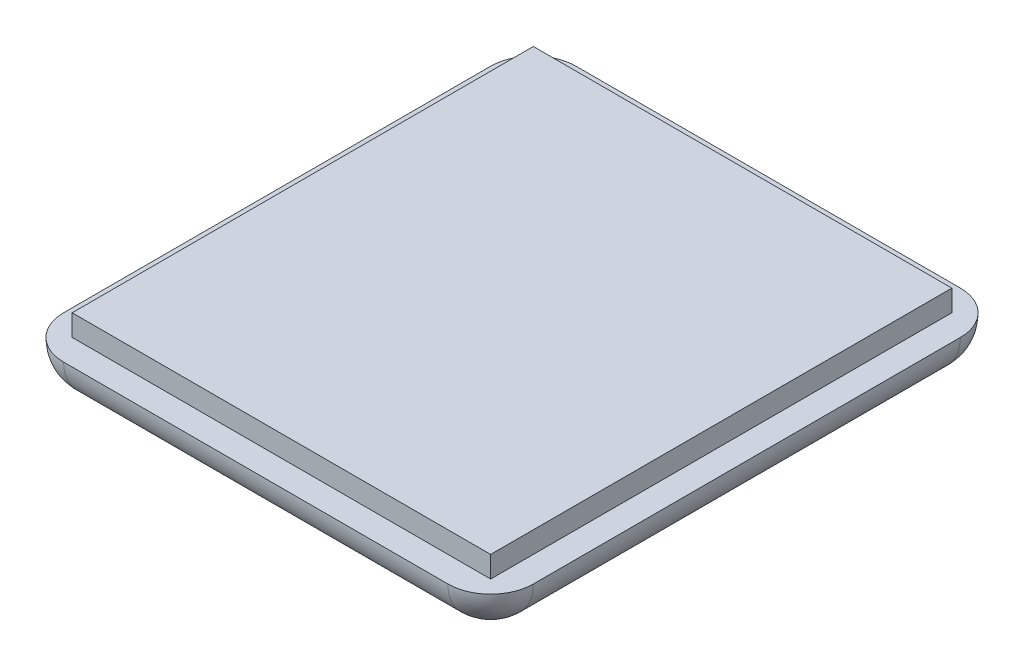
ISO-10303-21;
HEADER;
FILE_DESCRIPTION(('STEP AP214'),'2;1');
FILE_NAME('part.step','',(''),(''),'','','');
FILE_SCHEMA(('AUTOMOTIVE_DESIGN { 1 0 10303 214 1 1 1 1 }'));
ENDSEC;
DATA;
#1=APPLICATION_CONTEXT('core data for automotive mechanical design processes');
#2=APPLICATION_PROTOCOL_DEFINITION('international standard','automotive_design',2000,#1);
#3=PRODUCT_CONTEXT('',#1,'mechanical');
#4=PRODUCT('Part','Part','',(#3));
#5=PRODUCT_RELATED_PRODUCT_CATEGORY('part','',(#4));
#6=PRODUCT_DEFINITION_FORMATION('','',#4);
#7=PRODUCT_DEFINITION_CONTEXT('part definition',#1,'design');
#8=PRODUCT_DEFINITION('design','',#6,#7);
#9=PRODUCT_DEFINITION_SHAPE('','',#8);
#10=(LENGTH_UNIT() NAMED_UNIT(*) SI_UNIT(.MILLI.,.METRE.));
#11=(NAMED_UNIT(*) PLANE_ANGLE_UNIT() SI_UNIT($,.RADIAN.));
#12=(NAMED_UNIT(*) SI_UNIT($,.STERADIAN.) SOLID_ANGLE_UNIT());
#13=UNCERTAINTY_MEASURE_WITH_UNIT(LENGTH_MEASURE(1.E-05),#10,'distance_accuracy_value','');
#14=(GEOMETRIC_REPRESENTATION_CONTEXT(3) GLOBAL_UNCERTAINTY_ASSIGNED_CONTEXT((#13)) GLOBAL_UNIT_ASSIGNED_CONTEXT((#10,
#11,#12)) REPRESENTATION_CONTEXT('',''));
#15=CARTESIAN_POINT('',(0.,0.,0.));
#16=DIRECTION('',(0.,0.,1.));
#17=DIRECTION('',(1.,0.,0.));
#18=AXIS2_PLACEMENT_3D('',#15,#16,#17);
#19=CARTESIAN_POINT('',(-24.5,2.5,-27.));
#20=DIRECTION('',(1.,0.,0.));
#21=DIRECTION('',(0.,0.,-1.));
#22=AXIS2_PLACEMENT_3D('',#19,#20,#21);
#23=PLANE('',#22);
#24=DIRECTION('',(0.,0.,1.));
#25=VECTOR('',#24,1.);
#26=CARTESIAN_POINT('',(-24.5,0.,-27.));
#27=LINE('',#26,#25);
#28=CARTESIAN_POINT('',(-24.5,0.,-27.));
#29=VERTEX_POINT('',#28);
#30=CARTESIAN_POINT('',(-24.5,0.,27.));
#31=VERTEX_POINT('',#30);
#32=EDGE_CURVE('E119',#29,#31,#27,.T.);
#33=ORIENTED_EDGE('',*,*,#32,.T.);
#34=DIRECTION('',(0.,-1.,0.));
#35=VECTOR('',#34,1.);
#36=CARTESIAN_POINT('',(-24.5,2.5,27.));
#37=LINE('',#36,#35);
#38=CARTESIAN_POINT('',(-24.5,2.5,27.));
#39=VERTEX_POINT('',#38);
#40=EDGE_CURVE('E129',#39,#31,#37,.T.);
#41=ORIENTED_EDGE('',*,*,#40,.F.);
#42=DIRECTION('',(0.,0.,1.));
#43=VECTOR('',#42,1.);
#44=CARTESIAN_POINT('',(-24.5,2.5,-27.));
#45=LINE('',#44,#43);
#46=CARTESIAN_POINT('',(-24.5,2.5,-27.));
#47=VERTEX_POINT('',#46);
#48=EDGE_CURVE('E156',#47,#39,#45,.T.);
#49=ORIENTED_EDGE('',*,*,#48,.F.);
#50=DIRECTION('',(0.,-1.,0.));
#51=VECTOR('',#50,1.);
#52=CARTESIAN_POINT('',(-24.5,2.5,-27.));
#53=LINE('',#52,#51);
#54=EDGE_CURVE('E141',#47,#29,#53,.T.);
#55=ORIENTED_EDGE('',*,*,#54,.T.);
#56=EDGE_LOOP('',(#33,#41,#49,#55));
#57=FACE_BOUND('',#56,.T.);
#58=ADVANCED_FACE('F39',(#57),#23,.F.);
#59=CARTESIAN_POINT('',(-24.5,2.5,27.));
#60=DIRECTION('',(0.,0.,-1.));
#61=DIRECTION('',(-1.,0.,0.));
#62=AXIS2_PLACEMENT_3D('',#59,#60,#61);
#63=PLANE('',#62);
#64=DIRECTION('',(1.,0.,0.));
#65=VECTOR('',#64,1.);
#66=CARTESIAN_POINT('',(-24.5,0.,27.));
#67=LINE('',#66,#65);
#68=CARTESIAN_POINT('',(24.5,0.,27.));
#69=VERTEX_POINT('',#68);
#70=EDGE_CURVE('E115',#31,#69,#67,.T.);
#71=ORIENTED_EDGE('',*,*,#70,.T.);
#72=DIRECTION('',(0.,-1.,0.));
#73=VECTOR('',#72,1.);
#74=CARTESIAN_POINT('',(24.5,2.5,27.));
#75=LINE('',#74,#73);
#76=CARTESIAN_POINT('',(24.5,2.5,27.));
#77=VERTEX_POINT('',#76);
#78=EDGE_CURVE('E137',#77,#69,#75,.T.);
#79=ORIENTED_EDGE('',*,*,#78,.F.);
#80=DIRECTION('',(1.,0.,0.));
#81=VECTOR('',#80,1.);
#82=CARTESIAN_POINT('',(-24.5,2.5,27.));
#83=LINE('',#82,#81);
#84=EDGE_CURVE('E131',#39,#77,#83,.T.);
#85=ORIENTED_EDGE('',*,*,#84,.F.);
#86=ORIENTED_EDGE('',*,*,#40,.T.);
#87=EDGE_LOOP('',(#71,#79,#85,#86));
#88=FACE_BOUND('',#87,.T.);
#89=ADVANCED_FACE('F130',(#88),#63,.F.);
#90=CARTESIAN_POINT('',(24.5,2.5,-27.));
#91=DIRECTION('',(-1.,0.,0.));
#92=DIRECTION('',(0.,0.,1.));
#93=AXIS2_PLACEMENT_3D('',#90,#91,#92);
#94=PLANE('',#93);
#95=DIRECTION('',(0.,0.,-1.));
#96=VECTOR('',#95,1.);
#97=CARTESIAN_POINT('',(24.5,0.,-27.));
#98=LINE('',#97,#96);
#99=CARTESIAN_POINT('',(24.5,0.,-27.));
#100=VERTEX_POINT('',#99);
#101=EDGE_CURVE('E122',#69,#100,#98,.T.);
#102=ORIENTED_EDGE('',*,*,#101,.T.);
#103=DIRECTION('',(0.,-1.,0.));
#104=VECTOR('',#103,1.);
#105=CARTESIAN_POINT('',(24.5,2.5,-27.));
#106=LINE('',#105,#104);
#107=CARTESIAN_POINT('',(24.5,2.5,-27.));
#108=VERTEX_POINT('',#107);
#109=EDGE_CURVE('E159',#108,#100,#106,.T.);
#110=ORIENTED_EDGE('',*,*,#109,.F.);
#111=DIRECTION('',(0.,0.,-1.));
#112=VECTOR('',#111,1.);
#113=CARTESIAN_POINT('',(24.5,2.5,-27.));
#114=LINE('',#113,#112);
#115=EDGE_CURVE('E235',#77,#108,#114,.T.);
#116=ORIENTED_EDGE('',*,*,#115,.F.);
#117=ORIENTED_EDGE('',*,*,#78,.T.);
#118=EDGE_LOOP('',(#102,#110,#116,#117));
#119=FACE_BOUND('',#118,.T.);
#120=ADVANCED_FACE('F246',(#119),#94,.F.);
#121=CARTESIAN_POINT('',(-24.5,2.5,-27.));
#122=DIRECTION('',(0.,0.,1.));
#123=DIRECTION('',(1.,0.,0.));
#124=AXIS2_PLACEMENT_3D('',#121,#122,#123);
#125=PLANE('',#124);
#126=DIRECTION('',(-1.,0.,0.));
#127=VECTOR('',#126,1.);
#128=CARTESIAN_POINT('',(-24.5,0.,-27.));
#129=LINE('',#128,#127);
#130=EDGE_CURVE('E153',#100,#29,#129,.T.);
#131=ORIENTED_EDGE('',*,*,#130,.T.);
#132=ORIENTED_EDGE('',*,*,#54,.F.);
#133=DIRECTION('',(-1.,0.,0.));
#134=VECTOR('',#133,1.);
#135=CARTESIAN_POINT('',(-24.5,2.5,-27.));
#136=LINE('',#135,#134);
#137=EDGE_CURVE('E148',#108,#47,#136,.T.);
#138=ORIENTED_EDGE('',*,*,#137,.F.);
#139=ORIENTED_EDGE('',*,*,#109,.T.);
#140=EDGE_LOOP('',(#131,#132,#138,#139));
#141=FACE_BOUND('',#140,.T.);
#142=ADVANCED_FACE('F244',(#141),#125,.F.);
#143=CARTESIAN_POINT('',(0.,2.5,0.));
#144=DIRECTION('',(0.,1.,0.));
#145=DIRECTION('',(0.,0.,1.));
#146=AXIS2_PLACEMENT_3D('',#143,#144,#145);
#147=PLANE('',#146);
#148=ORIENTED_EDGE('',*,*,#48,.T.);
#149=ORIENTED_EDGE('',*,*,#84,.T.);
#150=ORIENTED_EDGE('',*,*,#115,.T.);
#151=ORIENTED_EDGE('',*,*,#137,.T.);
#152=EDGE_LOOP('',(#148,#149,#150,#151));
#153=FACE_BOUND('',#152,.T.);
#154=ADVANCED_FACE('F242',(#153),#147,.T.);
#155=CARTESIAN_POINT('',(0.,-5.,0.));
#156=DIRECTION('',(0.,-1.,0.));
#157=DIRECTION('',(0.,0.,-1.));
#158=AXIS2_PLACEMENT_3D('',#155,#156,#157);
#159=PLANE('',#158);
#160=DIRECTION('',(-1.,0.,0.));
#161=VECTOR('',#160,1.);
#162=CARTESIAN_POINT('',(-27.5,-5.,25.));
#163=LINE('',#162,#161);
#164=CARTESIAN_POINT('',(22.5,-5.,25.));
#165=VERTEX_POINT('',#164);
#166=CARTESIAN_POINT('',(-22.5,-5.,25.));
#167=VERTEX_POINT('',#166);
#168=EDGE_CURVE('E136',#165,#167,#163,.T.);
#169=ORIENTED_EDGE('',*,*,#168,.T.);
#170=DIRECTION('',(0.,0.,-1.));
#171=VECTOR('',#170,1.);
#172=CARTESIAN_POINT('',(-22.5,-5.,-30.));
#173=LINE('',#172,#171);
#174=CARTESIAN_POINT('',(-22.5,-5.,-25.));
#175=VERTEX_POINT('',#174);
#176=EDGE_CURVE('E173',#167,#175,#173,.T.);
#177=ORIENTED_EDGE('',*,*,#176,.T.);
#178=DIRECTION('',(1.,0.,0.));
#179=VECTOR('',#178,1.);
#180=CARTESIAN_POINT('',(27.5,-5.,-25.));
#181=LINE('',#180,#179);
#182=CARTESIAN_POINT('',(22.5,-5.,-25.));
#183=VERTEX_POINT('',#182);
#184=EDGE_CURVE('E170',#175,#183,#181,.T.);
#185=ORIENTED_EDGE('',*,*,#184,.T.);
#186=DIRECTION('',(0.,0.,1.));
#187=VECTOR('',#186,1.);
#188=CARTESIAN_POINT('',(22.5,-5.,30.));
#189=LINE('',#188,#187);
#190=EDGE_CURVE('E167',#183,#165,#189,.T.);
#191=ORIENTED_EDGE('',*,*,#190,.T.);
#192=EDGE_LOOP('',(#169,#177,#185,#191));
#193=FACE_BOUND('',#192,.T.);
#194=ADVANCED_FACE('F290',(#193),#159,.T.);
#195=CARTESIAN_POINT('',(0.,0.,0.));
#196=DIRECTION('',(0.,-1.,0.));
#197=DIRECTION('',(0.,0.,-1.));
#198=AXIS2_PLACEMENT_3D('',#195,#196,#197);
#199=PLANE('',#198);
#200=ORIENTED_EDGE('',*,*,#32,.F.);
#201=ORIENTED_EDGE('',*,*,#130,.F.);
#202=ORIENTED_EDGE('',*,*,#101,.F.);
#203=ORIENTED_EDGE('',*,*,#70,.F.);
#204=EDGE_LOOP('',(#200,#201,#202,#203));
#205=FACE_BOUND('',#204,.T.);
#206=DIRECTION('',(0.,0.,-1.));
#207=VECTOR('',#206,1.);
#208=CARTESIAN_POINT('',(-27.5,0.,30.));
#209=LINE('',#208,#207);
#210=CARTESIAN_POINT('',(-27.5,0.,25.));
#211=VERTEX_POINT('',#210);
#212=CARTESIAN_POINT('',(-27.5,0.,-25.));
#213=VERTEX_POINT('',#212);
#214=EDGE_CURVE('E215',#211,#213,#209,.T.);
#215=ORIENTED_EDGE('',*,*,#214,.F.);
#216=CARTESIAN_POINT('',(-22.5,0.,25.));
#217=DIRECTION('',(0.,-1.,0.));
#218=DIRECTION('',(0.,0.,-1.));
#219=AXIS2_PLACEMENT_3D('',#216,#217,#218);
#220=CIRCLE('',#219,5.);
#221=CARTESIAN_POINT('',(-22.5,0.,30.));
#222=VERTEX_POINT('',#221);
#223=EDGE_CURVE('E11',#211,#222,#220,.F.);
#224=ORIENTED_EDGE('',*,*,#223,.T.);
#225=DIRECTION('',(-1.,0.,0.));
#226=VECTOR('',#225,1.);
#227=CARTESIAN_POINT('',(-27.5,0.,30.));
#228=LINE('',#227,#226);
#229=CARTESIAN_POINT('',(22.5,0.,30.));
#230=VERTEX_POINT('',#229);
#231=EDGE_CURVE('E59',#230,#222,#228,.T.);
#232=ORIENTED_EDGE('',*,*,#231,.F.);
#233=CARTESIAN_POINT('',(22.5,0.,25.));
#234=DIRECTION('',(0.,-1.,0.));
#235=DIRECTION('',(0.,0.,-1.));
#236=AXIS2_PLACEMENT_3D('',#233,#234,#235);
#237=CIRCLE('',#236,5.);
#238=CARTESIAN_POINT('',(27.5,0.,25.));
#239=VERTEX_POINT('',#238);
#240=EDGE_CURVE('E49',#230,#239,#237,.F.);
#241=ORIENTED_EDGE('',*,*,#240,.T.);
#242=DIRECTION('',(0.,0.,1.));
#243=VECTOR('',#242,1.);
#244=CARTESIAN_POINT('',(27.5,0.,30.));
#245=LINE('',#244,#243);
#246=CARTESIAN_POINT('',(27.5,0.,-25.));
#247=VERTEX_POINT('',#246);
#248=EDGE_CURVE('E145',#247,#239,#245,.T.);
#249=ORIENTED_EDGE('',*,*,#248,.F.);
#250=CARTESIAN_POINT('',(22.5,0.,-25.));
#251=DIRECTION('',(0.,-1.,0.));
#252=DIRECTION('',(0.,0.,-1.));
#253=AXIS2_PLACEMENT_3D('',#250,#251,#252);
#254=CIRCLE('',#253,5.);
#255=CARTESIAN_POINT('',(22.5,0.,-30.));
#256=VERTEX_POINT('',#255);
#257=EDGE_CURVE('E180',#247,#256,#254,.F.);
#258=ORIENTED_EDGE('',*,*,#257,.T.);
#259=DIRECTION('',(1.,0.,0.));
#260=VECTOR('',#259,1.);
#261=CARTESIAN_POINT('',(-27.5,0.,-30.));
#262=LINE('',#261,#260);
#263=CARTESIAN_POINT('',(-22.5,0.,-30.));
#264=VERTEX_POINT('',#263);
#265=EDGE_CURVE('E221',#264,#256,#262,.T.);
#266=ORIENTED_EDGE('',*,*,#265,.F.);
#267=CARTESIAN_POINT('',(-22.5,0.,-25.));
#268=DIRECTION('',(0.,-1.,0.));
#269=DIRECTION('',(0.,0.,-1.));
#270=AXIS2_PLACEMENT_3D('',#267,#268,#269);
#271=CIRCLE('',#270,5.);
#272=EDGE_CURVE('E177',#264,#213,#271,.F.);
#273=ORIENTED_EDGE('',*,*,#272,.T.);
#274=EDGE_LOOP('',(#215,#224,#232,#241,#249,#258,#266,#273));
#275=FACE_BOUND('',#274,.T.);
#276=ADVANCED_FACE('F117',(#205,#275),#199,.F.);
#277=CARTESIAN_POINT('',(22.5,0.,0.));
#278=DIRECTION('',(0.,0.,-1.));
#279=DIRECTION('',(-1.,0.,0.));
#280=AXIS2_PLACEMENT_3D('',#277,#278,#279);
#281=CYLINDRICAL_SURFACE('',#280,5.);
#282=CARTESIAN_POINT('',(22.5,0.,-25.));
#283=DIRECTION('',(0.,0.,-1.));
#284=DIRECTION('',(0.,1.,0.));
#285=AXIS2_PLACEMENT_3D('',#282,#283,#284);
#286=CIRCLE('',#285,5.);
#287=EDGE_CURVE('E206',#247,#183,#286,.T.);
#288=ORIENTED_EDGE('',*,*,#287,.F.);
#289=ORIENTED_EDGE('',*,*,#248,.T.);
#290=CARTESIAN_POINT('',(22.5,0.,25.));
#291=DIRECTION('',(0.,0.,1.));
#292=DIRECTION('',(1.,0.,0.));
#293=AXIS2_PLACEMENT_3D('',#290,#291,#292);
#294=CIRCLE('',#293,5.);
#295=EDGE_CURVE('E43',#165,#239,#294,.T.);
#296=ORIENTED_EDGE('',*,*,#295,.F.);
#297=ORIENTED_EDGE('',*,*,#190,.F.);
#298=EDGE_LOOP('',(#288,#289,#296,#297));
#299=FACE_BOUND('',#298,.T.);
#300=ADVANCED_FACE('F41',(#299),#281,.T.);
#301=CARTESIAN_POINT('',(22.5,0.,25.));
#302=DIRECTION('',(1.,0.,0.));
#303=DIRECTION('',(0.,0.,-1.));
#304=AXIS2_PLACEMENT_3D('',#301,#302,#303);
#305=SPHERICAL_SURFACE('',#304,5.);
#306=ORIENTED_EDGE('',*,*,#295,.T.);
#307=ORIENTED_EDGE('',*,*,#240,.F.);
#308=CARTESIAN_POINT('',(22.5,0.,25.));
#309=DIRECTION('',(1.,0.,0.));
#310=DIRECTION('',(0.,1.,0.));
#311=AXIS2_PLACEMENT_3D('',#308,#309,#310);
#312=CIRCLE('',#311,5.);
#313=EDGE_CURVE('E203',#165,#230,#312,.F.);
#314=ORIENTED_EDGE('',*,*,#313,.F.);
#315=EDGE_LOOP('',(#306,#307,#314));
#316=FACE_BOUND('',#315,.T.);
#317=ADVANCED_FACE('F281',(#316),#305,.T.);
#318=CARTESIAN_POINT('',(22.5,0.,-25.));
#319=DIRECTION('',(1.,0.,0.));
#320=DIRECTION('',(0.,0.,-1.));
#321=AXIS2_PLACEMENT_3D('',#318,#319,#320);
#322=SPHERICAL_SURFACE('',#321,5.);
#323=ORIENTED_EDGE('',*,*,#257,.F.);
#324=ORIENTED_EDGE('',*,*,#287,.T.);
#325=CARTESIAN_POINT('',(22.5,0.,-25.));
#326=DIRECTION('',(1.,0.,0.));
#327=DIRECTION('',(0.,0.,-1.));
#328=AXIS2_PLACEMENT_3D('',#325,#326,#327);
#329=CIRCLE('',#328,5.);
#330=EDGE_CURVE('E199',#256,#183,#329,.F.);
#331=ORIENTED_EDGE('',*,*,#330,.F.);
#332=EDGE_LOOP('',(#323,#324,#331));
#333=FACE_BOUND('',#332,.T.);
#334=ADVANCED_FACE('F278',(#333),#322,.T.);
#335=CARTESIAN_POINT('',(0.,0.,25.));
#336=DIRECTION('',(1.,0.,0.));
#337=DIRECTION('',(0.,0.,-1.));
#338=AXIS2_PLACEMENT_3D('',#335,#336,#337);
#339=CYLINDRICAL_SURFACE('',#338,5.);
#340=ORIENTED_EDGE('',*,*,#313,.T.);
#341=ORIENTED_EDGE('',*,*,#231,.T.);
#342=CARTESIAN_POINT('',(-22.5,0.,25.));
#343=DIRECTION('',(-1.,0.,0.));
#344=DIRECTION('',(0.,0.,1.));
#345=AXIS2_PLACEMENT_3D('',#342,#343,#344);
#346=CIRCLE('',#345,5.);
#347=EDGE_CURVE('E195',#167,#222,#346,.T.);
#348=ORIENTED_EDGE('',*,*,#347,.F.);
#349=ORIENTED_EDGE('',*,*,#168,.F.);
#350=EDGE_LOOP('',(#340,#341,#348,#349));
#351=FACE_BOUND('',#350,.T.);
#352=ADVANCED_FACE('F274',(#351),#339,.T.);
#353=CARTESIAN_POINT('',(0.,0.,-25.));
#354=DIRECTION('',(-1.,0.,0.));
#355=DIRECTION('',(0.,0.,1.));
#356=AXIS2_PLACEMENT_3D('',#353,#354,#355);
#357=CYLINDRICAL_SURFACE('',#356,5.);
#358=ORIENTED_EDGE('',*,*,#330,.T.);
#359=ORIENTED_EDGE('',*,*,#184,.F.);
#360=CARTESIAN_POINT('',(-22.5,0.,-25.));
#361=DIRECTION('',(-1.,0.,0.));
#362=DIRECTION('',(0.,0.,1.));
#363=AXIS2_PLACEMENT_3D('',#360,#361,#362);
#364=CIRCLE('',#363,5.);
#365=EDGE_CURVE('E191',#264,#175,#364,.T.);
#366=ORIENTED_EDGE('',*,*,#365,.F.);
#367=ORIENTED_EDGE('',*,*,#265,.T.);
#368=EDGE_LOOP('',(#358,#359,#366,#367));
#369=FACE_BOUND('',#368,.T.);
#370=ADVANCED_FACE('F270',(#369),#357,.T.);
#371=CARTESIAN_POINT('',(-22.5,0.,25.));
#372=DIRECTION('',(0.,0.,1.));
#373=DIRECTION('',(1.,0.,0.));
#374=AXIS2_PLACEMENT_3D('',#371,#372,#373);
#375=SPHERICAL_SURFACE('',#374,5.);
#376=ORIENTED_EDGE('',*,*,#347,.T.);
#377=ORIENTED_EDGE('',*,*,#223,.F.);
#378=CARTESIAN_POINT('',(-22.5,0.,25.));
#379=DIRECTION('',(0.,0.,1.));
#380=DIRECTION('',(1.,0.,0.));
#381=AXIS2_PLACEMENT_3D('',#378,#379,#380);
#382=CIRCLE('',#381,5.);
#383=EDGE_CURVE('E188',#167,#211,#382,.F.);
#384=ORIENTED_EDGE('',*,*,#383,.F.);
#385=EDGE_LOOP('',(#376,#377,#384));
#386=FACE_BOUND('',#385,.T.);
#387=ADVANCED_FACE('F266',(#386),#375,.T.);
#388=CARTESIAN_POINT('',(-22.5,0.,-25.));
#389=DIRECTION('',(0.,0.,-1.));
#390=DIRECTION('',(-1.,0.,0.));
#391=AXIS2_PLACEMENT_3D('',#388,#389,#390);
#392=SPHERICAL_SURFACE('',#391,5.);
#393=ORIENTED_EDGE('',*,*,#272,.F.);
#394=ORIENTED_EDGE('',*,*,#365,.T.);
#395=CARTESIAN_POINT('',(-22.5,0.,-25.));
#396=DIRECTION('',(0.,0.,-1.));
#397=DIRECTION('',(-1.,0.,0.));
#398=AXIS2_PLACEMENT_3D('',#395,#396,#397);
#399=CIRCLE('',#398,5.);
#400=EDGE_CURVE('E185',#213,#175,#399,.F.);
#401=ORIENTED_EDGE('',*,*,#400,.F.);
#402=EDGE_LOOP('',(#393,#394,#401));
#403=FACE_BOUND('',#402,.T.);
#404=ADVANCED_FACE('F263',(#403),#392,.T.);
#405=CARTESIAN_POINT('',(-22.5,0.,0.));
#406=DIRECTION('',(0.,0.,1.));
#407=DIRECTION('',(1.,0.,0.));
#408=AXIS2_PLACEMENT_3D('',#405,#406,#407);
#409=CYLINDRICAL_SURFACE('',#408,5.);
#410=ORIENTED_EDGE('',*,*,#383,.T.);
#411=ORIENTED_EDGE('',*,*,#214,.T.);
#412=ORIENTED_EDGE('',*,*,#400,.T.);
#413=ORIENTED_EDGE('',*,*,#176,.F.);
#414=EDGE_LOOP('',(#410,#411,#412,#413));
#415=FACE_BOUND('',#414,.T.);
#416=ADVANCED_FACE('F260',(#415),#409,.T.);
#417=CLOSED_SHELL('',(#58,#89,#120,#142,#154,#194,#276,#300,#317,#334,#352,#370,#387,#404,#416));
#418=MANIFOLD_SOLID_BREP('B2',#417);
#419=ADVANCED_BREP_SHAPE_REPRESENTATION('',(#18,#418),#14);
#420=SHAPE_DEFINITION_REPRESENTATION(#9,#419);
ENDSEC;
END-ISO-10303-21;
